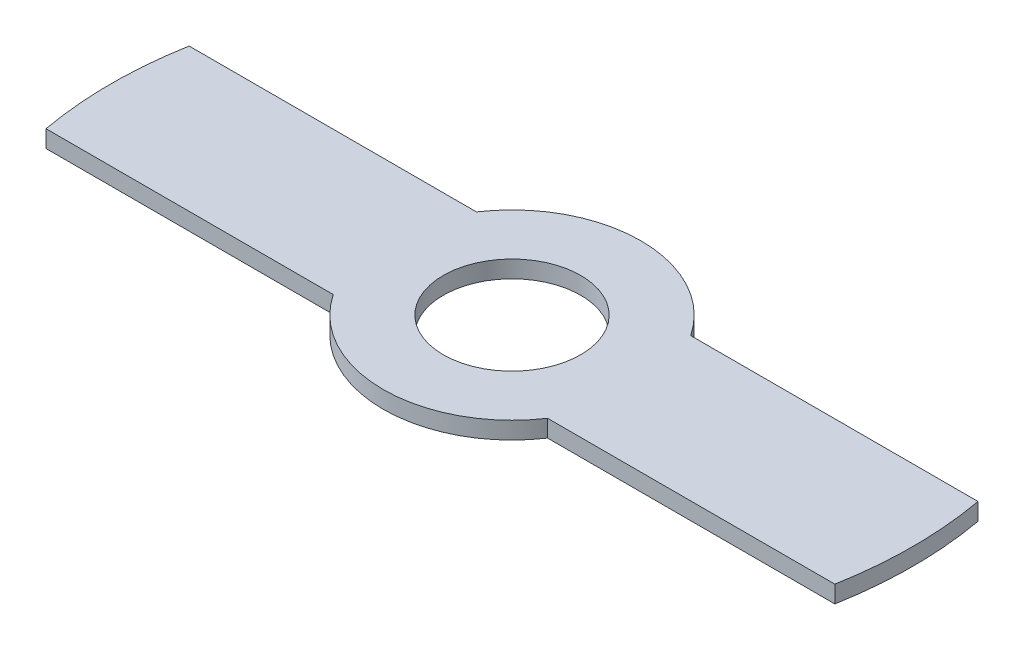
ISO-10303-21;
HEADER;
FILE_DESCRIPTION(('STEP AP214'),'2;1');
FILE_NAME('part.step','',(''),(''),'','','');
FILE_SCHEMA(('AUTOMOTIVE_DESIGN { 1 0 10303 214 1 1 1 1 }'));
ENDSEC;
DATA;
#1=APPLICATION_CONTEXT('core data for automotive mechanical design processes');
#2=APPLICATION_PROTOCOL_DEFINITION('international standard','automotive_design',2000,#1);
#3=PRODUCT_CONTEXT('',#1,'mechanical');
#4=PRODUCT('Part','Part','',(#3));
#5=PRODUCT_RELATED_PRODUCT_CATEGORY('part','',(#4));
#6=PRODUCT_DEFINITION_FORMATION('','',#4);
#7=PRODUCT_DEFINITION_CONTEXT('part definition',#1,'design');
#8=PRODUCT_DEFINITION('design','',#6,#7);
#9=PRODUCT_DEFINITION_SHAPE('','',#8);
#10=(LENGTH_UNIT() NAMED_UNIT(*) SI_UNIT(.MILLI.,.METRE.));
#11=(NAMED_UNIT(*) PLANE_ANGLE_UNIT() SI_UNIT($,.RADIAN.));
#12=(NAMED_UNIT(*) SI_UNIT($,.STERADIAN.) SOLID_ANGLE_UNIT());
#13=UNCERTAINTY_MEASURE_WITH_UNIT(LENGTH_MEASURE(1.E-05),#10,'distance_accuracy_value','');
#14=(GEOMETRIC_REPRESENTATION_CONTEXT(3) GLOBAL_UNCERTAINTY_ASSIGNED_CONTEXT((#13)) GLOBAL_UNIT_ASSIGNED_CONTEXT((#10,
#11,#12)) REPRESENTATION_CONTEXT('',''));
#15=CARTESIAN_POINT('',(0.,0.,0.));
#16=DIRECTION('',(0.,0.,1.));
#17=DIRECTION('',(1.,0.,0.));
#18=AXIS2_PLACEMENT_3D('',#15,#16,#17);
#19=CARTESIAN_POINT('',(0.,3.,0.));
#20=DIRECTION('',(0.,1.,0.));
#21=DIRECTION('',(0.,0.,1.));
#22=AXIS2_PLACEMENT_3D('',#19,#20,#21);
#23=PLANE('',#22);
#24=CARTESIAN_POINT('',(0.,3.,0.));
#25=DIRECTION('',(0.,1.,0.));
#26=DIRECTION('',(0.,0.,1.));
#27=AXIS2_PLACEMENT_3D('',#24,#25,#26);
#28=CIRCLE('',#27,22.5);
#29=CARTESIAN_POINT('',(18.7082869338697,3.,-12.5));
#30=VERTEX_POINT('',#29);
#31=CARTESIAN_POINT('',(-18.7082869338697,3.,-12.5));
#32=VERTEX_POINT('',#31);
#33=EDGE_CURVE('E155',#30,#32,#28,.T.);
#34=ORIENTED_EDGE('',*,*,#33,.T.);
#35=DIRECTION('',(-1.,0.,0.));
#36=VECTOR('',#35,1.);
#37=CARTESIAN_POINT('',(-18.7082869338697,3.,-12.5));
#38=LINE('',#37,#36);
#39=CARTESIAN_POINT('',(-68.8748865697796,3.,-12.5));
#40=VERTEX_POINT('',#39);
#41=EDGE_CURVE('E103',#32,#40,#38,.T.);
#42=ORIENTED_EDGE('',*,*,#41,.T.);
#43=CARTESIAN_POINT('',(0.,3.,0.));
#44=DIRECTION('',(0.,1.,0.));
#45=DIRECTION('',(0.,0.,1.));
#46=AXIS2_PLACEMENT_3D('',#43,#44,#45);
#47=CIRCLE('',#46,70.);
#48=CARTESIAN_POINT('',(-68.8748865697796,3.,12.5));
#49=VERTEX_POINT('',#48);
#50=EDGE_CURVE('E170',#40,#49,#47,.T.);
#51=ORIENTED_EDGE('',*,*,#50,.T.);
#52=DIRECTION('',(1.,0.,0.));
#53=VECTOR('',#52,1.);
#54=CARTESIAN_POINT('',(-18.7082869338697,3.,12.5));
#55=LINE('',#54,#53);
#56=CARTESIAN_POINT('',(-18.7082869338697,3.,12.5));
#57=VERTEX_POINT('',#56);
#58=EDGE_CURVE('E183',#49,#57,#55,.T.);
#59=ORIENTED_EDGE('',*,*,#58,.T.);
#60=CARTESIAN_POINT('',(0.,3.,0.));
#61=DIRECTION('',(0.,1.,0.));
#62=DIRECTION('',(0.,0.,1.));
#63=AXIS2_PLACEMENT_3D('',#60,#61,#62);
#64=CIRCLE('',#63,22.5);
#65=CARTESIAN_POINT('',(18.7082869338697,3.,12.5));
#66=VERTEX_POINT('',#65);
#67=EDGE_CURVE('E122',#57,#66,#64,.T.);
#68=ORIENTED_EDGE('',*,*,#67,.T.);
#69=DIRECTION('',(1.,0.,0.));
#70=VECTOR('',#69,1.);
#71=CARTESIAN_POINT('',(18.7082869338697,3.,12.5));
#72=LINE('',#71,#70);
#73=CARTESIAN_POINT('',(68.8748865697796,3.,12.5));
#74=VERTEX_POINT('',#73);
#75=EDGE_CURVE('E116',#66,#74,#72,.T.);
#76=ORIENTED_EDGE('',*,*,#75,.T.);
#77=CARTESIAN_POINT('',(0.,3.,0.));
#78=DIRECTION('',(0.,1.,0.));
#79=DIRECTION('',(0.,0.,1.));
#80=AXIS2_PLACEMENT_3D('',#77,#78,#79);
#81=CIRCLE('',#80,70.);
#82=CARTESIAN_POINT('',(68.8748865697796,3.,-12.5));
#83=VERTEX_POINT('',#82);
#84=EDGE_CURVE('E120',#74,#83,#81,.T.);
#85=ORIENTED_EDGE('',*,*,#84,.T.);
#86=DIRECTION('',(-1.,0.,0.));
#87=VECTOR('',#86,1.);
#88=CARTESIAN_POINT('',(18.7082869338697,3.,-12.5));
#89=LINE('',#88,#87);
#90=EDGE_CURVE('E60',#83,#30,#89,.T.);
#91=ORIENTED_EDGE('',*,*,#90,.T.);
#92=EDGE_LOOP('',(#34,#42,#51,#59,#68,#76,#85,#91));
#93=FACE_BOUND('',#92,.T.);
#94=CARTESIAN_POINT('',(0.,3.,0.));
#95=DIRECTION('',(0.,1.,0.));
#96=DIRECTION('',(0.,0.,1.));
#97=AXIS2_PLACEMENT_3D('',#94,#95,#96);
#98=CIRCLE('',#97,12.);
#99=CARTESIAN_POINT('',(0.,3.,12.));
#100=VERTEX_POINT('',#99);
#101=EDGE_CURVE('E144',#100,#100,#98,.T.);
#102=ORIENTED_EDGE('',*,*,#101,.F.);
#103=EDGE_LOOP('',(#102));
#104=FACE_BOUND('',#103,.T.);
#105=ADVANCED_FACE('F43',(#93,#104),#23,.T.);
#106=CARTESIAN_POINT('',(0.,0.,0.));
#107=DIRECTION('',(0.,1.,0.));
#108=DIRECTION('',(0.,0.,1.));
#109=AXIS2_PLACEMENT_3D('',#106,#107,#108);
#110=PLANE('',#109);
#111=CARTESIAN_POINT('',(0.,0.,0.));
#112=DIRECTION('',(0.,1.,0.));
#113=DIRECTION('',(0.,0.,1.));
#114=AXIS2_PLACEMENT_3D('',#111,#112,#113);
#115=CIRCLE('',#114,22.5);
#116=CARTESIAN_POINT('',(18.7082869338697,0.,-12.5));
#117=VERTEX_POINT('',#116);
#118=CARTESIAN_POINT('',(-18.7082869338697,0.,-12.5));
#119=VERTEX_POINT('',#118);
#120=EDGE_CURVE('E140',#117,#119,#115,.T.);
#121=ORIENTED_EDGE('',*,*,#120,.F.);
#122=DIRECTION('',(-1.,0.,0.));
#123=VECTOR('',#122,1.);
#124=CARTESIAN_POINT('',(18.7082869338697,0.,-12.5));
#125=LINE('',#124,#123);
#126=CARTESIAN_POINT('',(68.8748865697796,0.,-12.5));
#127=VERTEX_POINT('',#126);
#128=EDGE_CURVE('E95',#127,#117,#125,.T.);
#129=ORIENTED_EDGE('',*,*,#128,.F.);
#130=CARTESIAN_POINT('',(0.,0.,0.));
#131=DIRECTION('',(0.,1.,0.));
#132=DIRECTION('',(0.,0.,1.));
#133=AXIS2_PLACEMENT_3D('',#130,#131,#132);
#134=CIRCLE('',#133,70.);
#135=CARTESIAN_POINT('',(68.8748865697796,0.,12.5));
#136=VERTEX_POINT('',#135);
#137=EDGE_CURVE('E89',#136,#127,#134,.T.);
#138=ORIENTED_EDGE('',*,*,#137,.F.);
#139=DIRECTION('',(1.,0.,0.));
#140=VECTOR('',#139,1.);
#141=CARTESIAN_POINT('',(18.7082869338697,0.,12.5));
#142=LINE('',#141,#140);
#143=CARTESIAN_POINT('',(18.7082869338697,0.,12.5));
#144=VERTEX_POINT('',#143);
#145=EDGE_CURVE('E130',#144,#136,#142,.T.);
#146=ORIENTED_EDGE('',*,*,#145,.F.);
#147=CARTESIAN_POINT('',(0.,0.,0.));
#148=DIRECTION('',(0.,1.,0.));
#149=DIRECTION('',(0.,0.,1.));
#150=AXIS2_PLACEMENT_3D('',#147,#148,#149);
#151=CIRCLE('',#150,22.5);
#152=CARTESIAN_POINT('',(-18.7082869338697,0.,12.5));
#153=VERTEX_POINT('',#152);
#154=EDGE_CURVE('E150',#153,#144,#151,.T.);
#155=ORIENTED_EDGE('',*,*,#154,.F.);
#156=DIRECTION('',(1.,0.,0.));
#157=VECTOR('',#156,1.);
#158=CARTESIAN_POINT('',(-18.7082869338697,0.,12.5));
#159=LINE('',#158,#157);
#160=CARTESIAN_POINT('',(-68.8748865697796,0.,12.5));
#161=VERTEX_POINT('',#160);
#162=EDGE_CURVE('E148',#161,#153,#159,.T.);
#163=ORIENTED_EDGE('',*,*,#162,.F.);
#164=CARTESIAN_POINT('',(0.,0.,0.));
#165=DIRECTION('',(0.,1.,0.));
#166=DIRECTION('',(0.,0.,1.));
#167=AXIS2_PLACEMENT_3D('',#164,#165,#166);
#168=CIRCLE('',#167,70.);
#169=CARTESIAN_POINT('',(-68.8748865697796,0.,-12.5));
#170=VERTEX_POINT('',#169);
#171=EDGE_CURVE('E146',#170,#161,#168,.T.);
#172=ORIENTED_EDGE('',*,*,#171,.F.);
#173=DIRECTION('',(-1.,0.,0.));
#174=VECTOR('',#173,1.);
#175=CARTESIAN_POINT('',(-18.7082869338697,0.,-12.5));
#176=LINE('',#175,#174);
#177=EDGE_CURVE('E143',#119,#170,#176,.T.);
#178=ORIENTED_EDGE('',*,*,#177,.F.);
#179=EDGE_LOOP('',(#121,#129,#138,#146,#155,#163,#172,#178));
#180=FACE_BOUND('',#179,.T.);
#181=CARTESIAN_POINT('',(0.,0.,0.));
#182=DIRECTION('',(0.,1.,0.));
#183=DIRECTION('',(0.,0.,1.));
#184=AXIS2_PLACEMENT_3D('',#181,#182,#183);
#185=CIRCLE('',#184,12.);
#186=CARTESIAN_POINT('',(0.,0.,12.));
#187=VERTEX_POINT('',#186);
#188=EDGE_CURVE('E189',#187,#187,#185,.T.);
#189=ORIENTED_EDGE('',*,*,#188,.T.);
#190=EDGE_LOOP('',(#189));
#191=FACE_BOUND('',#190,.T.);
#192=ADVANCED_FACE('F174',(#180,#191),#110,.F.);
#193=CARTESIAN_POINT('',(0.,3.,0.));
#194=DIRECTION('',(0.,-1.,0.));
#195=DIRECTION('',(0.,0.,-1.));
#196=AXIS2_PLACEMENT_3D('',#193,#194,#195);
#197=CYLINDRICAL_SURFACE('',#196,22.5);
#198=ORIENTED_EDGE('',*,*,#120,.T.);
#199=DIRECTION('',(0.,-1.,0.));
#200=VECTOR('',#199,1.);
#201=CARTESIAN_POINT('',(-18.7082869338697,3.,-12.5));
#202=LINE('',#201,#200);
#203=EDGE_CURVE('E13',#32,#119,#202,.T.);
#204=ORIENTED_EDGE('',*,*,#203,.F.);
#205=ORIENTED_EDGE('',*,*,#33,.F.);
#206=DIRECTION('',(0.,-1.,0.));
#207=VECTOR('',#206,1.);
#208=CARTESIAN_POINT('',(18.7082869338697,3.,-12.5));
#209=LINE('',#208,#207);
#210=EDGE_CURVE('E136',#30,#117,#209,.T.);
#211=ORIENTED_EDGE('',*,*,#210,.T.);
#212=EDGE_LOOP('',(#198,#204,#205,#211));
#213=FACE_BOUND('',#212,.T.);
#214=ADVANCED_FACE('F45',(#213),#197,.T.);
#215=CARTESIAN_POINT('',(-18.7082869338697,3.,-12.5));
#216=DIRECTION('',(0.,0.,1.));
#217=DIRECTION('',(1.,0.,0.));
#218=AXIS2_PLACEMENT_3D('',#215,#216,#217);
#219=PLANE('',#218);
#220=ORIENTED_EDGE('',*,*,#177,.T.);
#221=DIRECTION('',(0.,-1.,0.));
#222=VECTOR('',#221,1.);
#223=CARTESIAN_POINT('',(-68.8748865697796,3.,-12.5));
#224=LINE('',#223,#222);
#225=EDGE_CURVE('E52',#40,#170,#224,.T.);
#226=ORIENTED_EDGE('',*,*,#225,.F.);
#227=ORIENTED_EDGE('',*,*,#41,.F.);
#228=ORIENTED_EDGE('',*,*,#203,.T.);
#229=EDGE_LOOP('',(#220,#226,#227,#228));
#230=FACE_BOUND('',#229,.T.);
#231=ADVANCED_FACE('F217',(#230),#219,.F.);
#232=CARTESIAN_POINT('',(0.,3.,0.));
#233=DIRECTION('',(0.,-1.,0.));
#234=DIRECTION('',(0.,0.,-1.));
#235=AXIS2_PLACEMENT_3D('',#232,#233,#234);
#236=CYLINDRICAL_SURFACE('',#235,70.);
#237=ORIENTED_EDGE('',*,*,#171,.T.);
#238=DIRECTION('',(0.,-1.,0.));
#239=VECTOR('',#238,1.);
#240=CARTESIAN_POINT('',(-68.8748865697796,3.,12.5));
#241=LINE('',#240,#239);
#242=EDGE_CURVE('E162',#49,#161,#241,.T.);
#243=ORIENTED_EDGE('',*,*,#242,.F.);
#244=ORIENTED_EDGE('',*,*,#50,.F.);
#245=ORIENTED_EDGE('',*,*,#225,.T.);
#246=EDGE_LOOP('',(#237,#243,#244,#245));
#247=FACE_BOUND('',#246,.T.);
#248=ADVANCED_FACE('F168',(#247),#236,.T.);
#249=CARTESIAN_POINT('',(-18.7082869338697,3.,12.5));
#250=DIRECTION('',(0.,0.,-1.));
#251=DIRECTION('',(-1.,0.,0.));
#252=AXIS2_PLACEMENT_3D('',#249,#250,#251);
#253=PLANE('',#252);
#254=ORIENTED_EDGE('',*,*,#162,.T.);
#255=DIRECTION('',(0.,-1.,0.));
#256=VECTOR('',#255,1.);
#257=CARTESIAN_POINT('',(-18.7082869338697,3.,12.5));
#258=LINE('',#257,#256);
#259=EDGE_CURVE('E159',#57,#153,#258,.T.);
#260=ORIENTED_EDGE('',*,*,#259,.F.);
#261=ORIENTED_EDGE('',*,*,#58,.F.);
#262=ORIENTED_EDGE('',*,*,#242,.T.);
#263=EDGE_LOOP('',(#254,#260,#261,#262));
#264=FACE_BOUND('',#263,.T.);
#265=ADVANCED_FACE('F179',(#264),#253,.F.);
#266=CARTESIAN_POINT('',(0.,3.,0.));
#267=DIRECTION('',(0.,-1.,0.));
#268=DIRECTION('',(0.,0.,-1.));
#269=AXIS2_PLACEMENT_3D('',#266,#267,#268);
#270=CYLINDRICAL_SURFACE('',#269,22.5);
#271=ORIENTED_EDGE('',*,*,#154,.T.);
#272=DIRECTION('',(0.,-1.,0.));
#273=VECTOR('',#272,1.);
#274=CARTESIAN_POINT('',(18.7082869338697,3.,12.5));
#275=LINE('',#274,#273);
#276=EDGE_CURVE('E131',#66,#144,#275,.T.);
#277=ORIENTED_EDGE('',*,*,#276,.F.);
#278=ORIENTED_EDGE('',*,*,#67,.F.);
#279=ORIENTED_EDGE('',*,*,#259,.T.);
#280=EDGE_LOOP('',(#271,#277,#278,#279));
#281=FACE_BOUND('',#280,.T.);
#282=ADVANCED_FACE('F182',(#281),#270,.T.);
#283=CARTESIAN_POINT('',(18.7082869338697,3.,12.5));
#284=DIRECTION('',(0.,0.,-1.));
#285=DIRECTION('',(-1.,0.,0.));
#286=AXIS2_PLACEMENT_3D('',#283,#284,#285);
#287=PLANE('',#286);
#288=ORIENTED_EDGE('',*,*,#145,.T.);
#289=DIRECTION('',(0.,-1.,0.));
#290=VECTOR('',#289,1.);
#291=CARTESIAN_POINT('',(68.8748865697796,3.,12.5));
#292=LINE('',#291,#290);
#293=EDGE_CURVE('E127',#74,#136,#292,.T.);
#294=ORIENTED_EDGE('',*,*,#293,.F.);
#295=ORIENTED_EDGE('',*,*,#75,.F.);
#296=ORIENTED_EDGE('',*,*,#276,.T.);
#297=EDGE_LOOP('',(#288,#294,#295,#296));
#298=FACE_BOUND('',#297,.T.);
#299=ADVANCED_FACE('F128',(#298),#287,.F.);
#300=CARTESIAN_POINT('',(0.,3.,0.));
#301=DIRECTION('',(0.,-1.,0.));
#302=DIRECTION('',(0.,0.,-1.));
#303=AXIS2_PLACEMENT_3D('',#300,#301,#302);
#304=CYLINDRICAL_SURFACE('',#303,70.);
#305=ORIENTED_EDGE('',*,*,#137,.T.);
#306=DIRECTION('',(0.,-1.,0.));
#307=VECTOR('',#306,1.);
#308=CARTESIAN_POINT('',(68.8748865697796,3.,-12.5));
#309=LINE('',#308,#307);
#310=EDGE_CURVE('E132',#83,#127,#309,.T.);
#311=ORIENTED_EDGE('',*,*,#310,.F.);
#312=ORIENTED_EDGE('',*,*,#84,.F.);
#313=ORIENTED_EDGE('',*,*,#293,.T.);
#314=EDGE_LOOP('',(#305,#311,#312,#313));
#315=FACE_BOUND('',#314,.T.);
#316=ADVANCED_FACE('F134',(#315),#304,.T.);
#317=CARTESIAN_POINT('',(18.7082869338697,3.,-12.5));
#318=DIRECTION('',(0.,0.,1.));
#319=DIRECTION('',(1.,0.,0.));
#320=AXIS2_PLACEMENT_3D('',#317,#318,#319);
#321=PLANE('',#320);
#322=ORIENTED_EDGE('',*,*,#128,.T.);
#323=ORIENTED_EDGE('',*,*,#210,.F.);
#324=ORIENTED_EDGE('',*,*,#90,.F.);
#325=ORIENTED_EDGE('',*,*,#310,.T.);
#326=EDGE_LOOP('',(#322,#323,#324,#325));
#327=FACE_BOUND('',#326,.T.);
#328=ADVANCED_FACE('F205',(#327),#321,.F.);
#329=CARTESIAN_POINT('',(0.,3.,0.));
#330=DIRECTION('',(0.,-1.,0.));
#331=DIRECTION('',(0.,0.,-1.));
#332=AXIS2_PLACEMENT_3D('',#329,#330,#331);
#333=CYLINDRICAL_SURFACE('',#332,12.);
#334=ORIENTED_EDGE('',*,*,#101,.T.);
#335=EDGE_LOOP('',(#334));
#336=FACE_BOUND('',#335,.T.);
#337=ORIENTED_EDGE('',*,*,#188,.F.);
#338=EDGE_LOOP('',(#337));
#339=FACE_BOUND('',#338,.T.);
#340=ADVANCED_FACE('F195',(#336,#339),#333,.F.);
#341=CLOSED_SHELL('',(#105,#192,#214,#231,#248,#265,#282,#299,#316,#328,#340));
#342=MANIFOLD_SOLID_BREP('B2',#341);
#343=ADVANCED_BREP_SHAPE_REPRESENTATION('',(#18,#342),#14);
#344=SHAPE_DEFINITION_REPRESENTATION(#9,#343);
ENDSEC;
END-ISO-10303-21;
